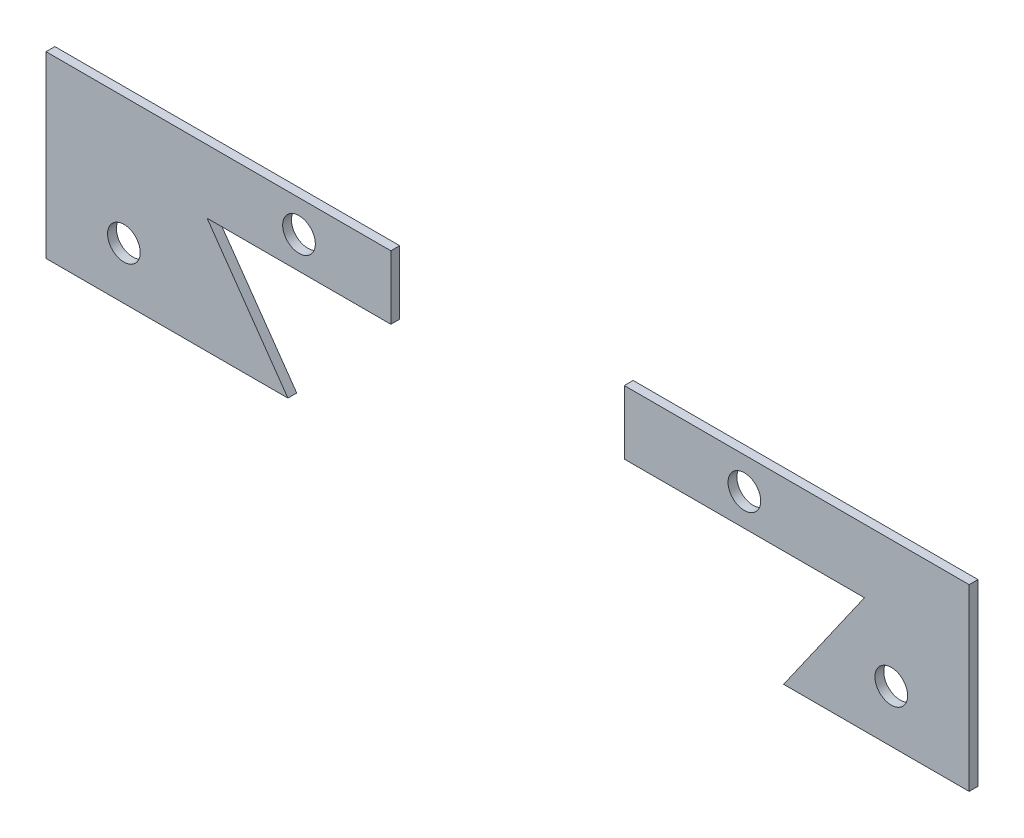
ISO-10303-21;
HEADER;
FILE_DESCRIPTION(('STEP AP214'),'2;1');
FILE_NAME('part.step','',(''),(''),'','','');
FILE_SCHEMA(('AUTOMOTIVE_DESIGN { 1 0 10303 214 1 1 1 1 }'));
ENDSEC;
DATA;
#1=APPLICATION_CONTEXT('core data for automotive mechanical design processes');
#2=APPLICATION_PROTOCOL_DEFINITION('international standard','automotive_design',2000,#1);
#3=PRODUCT_CONTEXT('',#1,'mechanical');
#4=PRODUCT('Part','Part','',(#3));
#5=PRODUCT_RELATED_PRODUCT_CATEGORY('part','',(#4));
#6=PRODUCT_DEFINITION_FORMATION('','',#4);
#7=PRODUCT_DEFINITION_CONTEXT('part definition',#1,'design');
#8=PRODUCT_DEFINITION('design','',#6,#7);
#9=PRODUCT_DEFINITION_SHAPE('','',#8);
#10=(LENGTH_UNIT() NAMED_UNIT(*) SI_UNIT(.MILLI.,.METRE.));
#11=(NAMED_UNIT(*) PLANE_ANGLE_UNIT() SI_UNIT($,.RADIAN.));
#12=(NAMED_UNIT(*) SI_UNIT($,.STERADIAN.) SOLID_ANGLE_UNIT());
#13=UNCERTAINTY_MEASURE_WITH_UNIT(LENGTH_MEASURE(1.E-05),#10,'distance_accuracy_value','');
#14=(GEOMETRIC_REPRESENTATION_CONTEXT(3) GLOBAL_UNCERTAINTY_ASSIGNED_CONTEXT((#13)) GLOBAL_UNIT_ASSIGNED_CONTEXT((#10,
#11,#12)) REPRESENTATION_CONTEXT('',''));
#15=CARTESIAN_POINT('',(0.,0.,0.));
#16=DIRECTION('',(0.,0.,1.));
#17=DIRECTION('',(1.,0.,0.));
#18=AXIS2_PLACEMENT_3D('',#15,#16,#17);
#19=CARTESIAN_POINT('',(79.556336319348,16.6369999999995,1.21412));
#20=DIRECTION('',(1.,0.,0.));
#21=DIRECTION('',(0.,1.,0.));
#22=AXIS2_PLACEMENT_3D('',#19,#20,#21);
#23=PLANE('',#22);
#24=DIRECTION('',(0.,-1.,0.));
#25=VECTOR('',#24,1.);
#26=CARTESIAN_POINT('',(79.556336319348,16.6369999999995,0.));
#27=LINE('',#26,#25);
#28=CARTESIAN_POINT('',(79.5563363193477,25.4000000000002,0.));
#29=VERTEX_POINT('',#28);
#30=CARTESIAN_POINT('',(79.556336319348,16.6369999999995,0.));
#31=VERTEX_POINT('',#30);
#32=EDGE_CURVE('E128',#29,#31,#27,.T.);
#33=ORIENTED_EDGE('',*,*,#32,.T.);
#34=DIRECTION('',(0.,0.,-1.));
#35=VECTOR('',#34,1.);
#36=CARTESIAN_POINT('',(79.556336319348,16.6369999999995,1.21412));
#37=LINE('',#36,#35);
#38=CARTESIAN_POINT('',(79.556336319348,16.6369999999995,1.21412));
#39=VERTEX_POINT('',#38);
#40=EDGE_CURVE('E12',#39,#31,#37,.T.);
#41=ORIENTED_EDGE('',*,*,#40,.F.);
#42=DIRECTION('',(0.,-1.,0.));
#43=VECTOR('',#42,1.);
#44=CARTESIAN_POINT('',(79.556336319348,16.6369999999995,1.21412));
#45=LINE('',#44,#43);
#46=CARTESIAN_POINT('',(79.5563363193477,25.4000000000002,1.21412));
#47=VERTEX_POINT('',#46);
#48=EDGE_CURVE('E139',#47,#39,#45,.T.);
#49=ORIENTED_EDGE('',*,*,#48,.F.);
#50=DIRECTION('',(0.,0.,-1.));
#51=VECTOR('',#50,1.);
#52=CARTESIAN_POINT('',(79.5563363193477,25.4000000000002,1.21412));
#53=LINE('',#52,#51);
#54=EDGE_CURVE('E124',#47,#29,#53,.T.);
#55=ORIENTED_EDGE('',*,*,#54,.T.);
#56=EDGE_LOOP('',(#33,#41,#49,#55));
#57=FACE_BOUND('',#56,.T.);
#58=ADVANCED_FACE('F44',(#57),#23,.F.);
#59=CARTESIAN_POINT('',(112.588788380752,16.6369999999995,1.21412));
#60=DIRECTION('',(0.,1.,0.));
#61=DIRECTION('',(-1.,0.,0.));
#62=AXIS2_PLACEMENT_3D('',#59,#60,#61);
#63=PLANE('',#62);
#64=DIRECTION('',(1.,0.,0.));
#65=VECTOR('',#64,1.);
#66=CARTESIAN_POINT('',(112.588788380752,16.6369999999995,0.));
#67=LINE('',#66,#65);
#68=CARTESIAN_POINT('',(112.588788380752,16.6369999999995,0.));
#69=VERTEX_POINT('',#68);
#70=EDGE_CURVE('E131',#31,#69,#67,.T.);
#71=ORIENTED_EDGE('',*,*,#70,.T.);
#72=DIRECTION('',(0.,0.,-1.));
#73=VECTOR('',#72,1.);
#74=CARTESIAN_POINT('',(112.588788380752,16.6369999999995,1.21412));
#75=LINE('',#74,#73);
#76=CARTESIAN_POINT('',(112.588788380752,16.6369999999995,1.21412));
#77=VERTEX_POINT('',#76);
#78=EDGE_CURVE('E52',#77,#69,#75,.T.);
#79=ORIENTED_EDGE('',*,*,#78,.F.);
#80=DIRECTION('',(1.,0.,0.));
#81=VECTOR('',#80,1.);
#82=CARTESIAN_POINT('',(112.588788380752,16.6369999999995,1.21412));
#83=LINE('',#82,#81);
#84=EDGE_CURVE('E97',#39,#77,#83,.T.);
#85=ORIENTED_EDGE('',*,*,#84,.F.);
#86=ORIENTED_EDGE('',*,*,#40,.T.);
#87=EDGE_LOOP('',(#71,#79,#85,#86));
#88=FACE_BOUND('',#87,.T.);
#89=ADVANCED_FACE('F164',(#88),#63,.F.);
#90=CARTESIAN_POINT('',(101.472993711673,0.762000000000164,1.21412));
#91=DIRECTION('',(0.819152044288988,-0.573576436351051,0.));
#92=DIRECTION('',(0.573576436351051,0.819152044288988,0.));
#93=AXIS2_PLACEMENT_3D('',#90,#91,#92);
#94=PLANE('',#93);
#95=DIRECTION('',(-0.573576436351051,-0.819152044288988,0.));
#96=VECTOR('',#95,1.);
#97=CARTESIAN_POINT('',(101.472993711673,0.762000000000164,0.));
#98=LINE('',#97,#96);
#99=CARTESIAN_POINT('',(101.472993711673,0.762000000000164,0.));
#100=VERTEX_POINT('',#99);
#101=EDGE_CURVE('E134',#69,#100,#98,.T.);
#102=ORIENTED_EDGE('',*,*,#101,.T.);
#103=DIRECTION('',(0.,0.,-1.));
#104=VECTOR('',#103,1.);
#105=CARTESIAN_POINT('',(101.472993711673,0.762000000000164,1.21412));
#106=LINE('',#105,#104);
#107=CARTESIAN_POINT('',(101.472993711673,0.762000000000164,1.21412));
#108=VERTEX_POINT('',#107);
#109=EDGE_CURVE('E119',#108,#100,#106,.T.);
#110=ORIENTED_EDGE('',*,*,#109,.F.);
#111=DIRECTION('',(-0.573576436351051,-0.819152044288988,0.));
#112=VECTOR('',#111,1.);
#113=CARTESIAN_POINT('',(101.472993711673,0.762000000000164,1.21412));
#114=LINE('',#113,#112);
#115=EDGE_CURVE('E110',#77,#108,#114,.T.);
#116=ORIENTED_EDGE('',*,*,#115,.F.);
#117=ORIENTED_EDGE('',*,*,#78,.T.);
#118=EDGE_LOOP('',(#102,#110,#116,#117));
#119=FACE_BOUND('',#118,.T.);
#120=ADVANCED_FACE('F145',(#119),#94,.F.);
#121=CARTESIAN_POINT('',(127.,0.762000000000165,1.21412));
#122=DIRECTION('',(0.,1.,0.));
#123=DIRECTION('',(-1.,0.,0.));
#124=AXIS2_PLACEMENT_3D('',#121,#122,#123);
#125=PLANE('',#124);
#126=DIRECTION('',(1.,0.,0.));
#127=VECTOR('',#126,1.);
#128=CARTESIAN_POINT('',(127.,0.762000000000165,0.));
#129=LINE('',#128,#127);
#130=CARTESIAN_POINT('',(127.,0.762000000000165,0.));
#131=VERTEX_POINT('',#130);
#132=EDGE_CURVE('E118',#100,#131,#129,.T.);
#133=ORIENTED_EDGE('',*,*,#132,.T.);
#134=DIRECTION('',(0.,0.,-1.));
#135=VECTOR('',#134,1.);
#136=CARTESIAN_POINT('',(127.,0.762000000000165,1.21412));
#137=LINE('',#136,#135);
#138=CARTESIAN_POINT('',(127.,0.762000000000165,1.21412));
#139=VERTEX_POINT('',#138);
#140=EDGE_CURVE('E115',#139,#131,#137,.T.);
#141=ORIENTED_EDGE('',*,*,#140,.F.);
#142=DIRECTION('',(1.,0.,0.));
#143=VECTOR('',#142,1.);
#144=CARTESIAN_POINT('',(127.,0.762000000000165,1.21412));
#145=LINE('',#144,#143);
#146=EDGE_CURVE('E104',#108,#139,#145,.T.);
#147=ORIENTED_EDGE('',*,*,#146,.F.);
#148=ORIENTED_EDGE('',*,*,#109,.T.);
#149=EDGE_LOOP('',(#133,#141,#147,#148));
#150=FACE_BOUND('',#149,.T.);
#151=ADVANCED_FACE('F116',(#150),#125,.F.);
#152=CARTESIAN_POINT('',(127.,25.4000000000002,1.21412));
#153=DIRECTION('',(-1.,0.,0.));
#154=DIRECTION('',(0.,0.,1.));
#155=AXIS2_PLACEMENT_3D('',#152,#153,#154);
#156=PLANE('',#155);
#157=DIRECTION('',(0.,1.,0.));
#158=VECTOR('',#157,1.);
#159=CARTESIAN_POINT('',(127.,25.4000000000002,0.));
#160=LINE('',#159,#158);
#161=CARTESIAN_POINT('',(127.,25.4000000000002,0.));
#162=VERTEX_POINT('',#161);
#163=EDGE_CURVE('E83',#131,#162,#160,.T.);
#164=ORIENTED_EDGE('',*,*,#163,.T.);
#165=DIRECTION('',(0.,0.,-1.));
#166=VECTOR('',#165,1.);
#167=CARTESIAN_POINT('',(127.,25.4000000000002,1.21412));
#168=LINE('',#167,#166);
#169=CARTESIAN_POINT('',(127.,25.4000000000002,1.21412));
#170=VERTEX_POINT('',#169);
#171=EDGE_CURVE('E120',#170,#162,#168,.T.);
#172=ORIENTED_EDGE('',*,*,#171,.F.);
#173=DIRECTION('',(0.,1.,0.));
#174=VECTOR('',#173,1.);
#175=CARTESIAN_POINT('',(127.,25.4000000000002,1.21412));
#176=LINE('',#175,#174);
#177=EDGE_CURVE('E108',#139,#170,#176,.T.);
#178=ORIENTED_EDGE('',*,*,#177,.F.);
#179=ORIENTED_EDGE('',*,*,#140,.T.);
#180=EDGE_LOOP('',(#164,#172,#178,#179));
#181=FACE_BOUND('',#180,.T.);
#182=ADVANCED_FACE('F122',(#181),#156,.F.);
#183=CARTESIAN_POINT('',(79.5563363193477,25.4000000000002,1.21412));
#184=DIRECTION('',(0.,-1.,0.));
#185=DIRECTION('',(0.,0.,-1.));
#186=AXIS2_PLACEMENT_3D('',#183,#184,#185);
#187=PLANE('',#186);
#188=DIRECTION('',(-1.,0.,0.));
#189=VECTOR('',#188,1.);
#190=CARTESIAN_POINT('',(79.5563363193477,25.4000000000002,0.));
#191=LINE('',#190,#189);
#192=EDGE_CURVE('E89',#162,#29,#191,.T.);
#193=ORIENTED_EDGE('',*,*,#192,.T.);
#194=ORIENTED_EDGE('',*,*,#54,.F.);
#195=DIRECTION('',(-1.,0.,0.));
#196=VECTOR('',#195,1.);
#197=CARTESIAN_POINT('',(79.5563363193477,25.4000000000002,1.21412));
#198=LINE('',#197,#196);
#199=EDGE_CURVE('E60',#170,#47,#198,.T.);
#200=ORIENTED_EDGE('',*,*,#199,.F.);
#201=ORIENTED_EDGE('',*,*,#171,.T.);
#202=EDGE_LOOP('',(#193,#194,#200,#201));
#203=FACE_BOUND('',#202,.T.);
#204=ADVANCED_FACE('F152',(#203),#187,.F.);
#205=CARTESIAN_POINT('',(0.,0.,1.21412));
#206=DIRECTION('',(0.,0.,-1.));
#207=DIRECTION('',(-1.,0.,0.));
#208=AXIS2_PLACEMENT_3D('',#205,#206,#207);
#209=PLANE('',#208);
#210=CARTESIAN_POINT('',(96.0725623500502,21.0184999999994,1.21411999999999));
#211=DIRECTION('',(0.,0.,1.));
#212=DIRECTION('',(1.,0.,0.));
#213=AXIS2_PLACEMENT_3D('',#210,#211,#212);
#214=CIRCLE('',#213,2.24789999999998);
#215=CARTESIAN_POINT('',(98.3204623500502,21.0184999999994,1.21411999999999));
#216=VERTEX_POINT('',#215);
#217=EDGE_CURVE('E230',#216,#216,#214,.T.);
#218=ORIENTED_EDGE('',*,*,#217,.F.);
#219=EDGE_LOOP('',(#218));
#220=FACE_BOUND('',#219,.T.);
#221=CARTESIAN_POINT('',(116.283551332731,7.93749999999953,1.21411999999999));
#222=DIRECTION('',(0.,0.,1.));
#223=DIRECTION('',(1.,0.,0.));
#224=AXIS2_PLACEMENT_3D('',#221,#222,#223);
#225=CIRCLE('',#224,2.24789999999998);
#226=CARTESIAN_POINT('',(118.531451332731,7.93749999999953,1.21411999999999));
#227=VERTEX_POINT('',#226);
#228=EDGE_CURVE('E232',#227,#227,#225,.T.);
#229=ORIENTED_EDGE('',*,*,#228,.F.);
#230=EDGE_LOOP('',(#229));
#231=FACE_BOUND('',#230,.T.);
#232=ORIENTED_EDGE('',*,*,#48,.T.);
#233=ORIENTED_EDGE('',*,*,#84,.T.);
#234=ORIENTED_EDGE('',*,*,#115,.T.);
#235=ORIENTED_EDGE('',*,*,#146,.T.);
#236=ORIENTED_EDGE('',*,*,#177,.T.);
#237=ORIENTED_EDGE('',*,*,#199,.T.);
#238=EDGE_LOOP('',(#232,#233,#234,#235,#236,#237));
#239=FACE_BOUND('',#238,.T.);
#240=ADVANCED_FACE('F106',(#220,#231,#239),#209,.F.);
#241=CARTESIAN_POINT('',(0.,0.,0.));
#242=DIRECTION('',(0.,0.,-1.));
#243=DIRECTION('',(-1.,0.,0.));
#244=AXIS2_PLACEMENT_3D('',#241,#242,#243);
#245=PLANE('',#244);
#246=CARTESIAN_POINT('',(96.0725623500502,21.0184999999994,0.));
#247=DIRECTION('',(0.,0.,1.));
#248=DIRECTION('',(1.,0.,0.));
#249=AXIS2_PLACEMENT_3D('',#246,#247,#248);
#250=CIRCLE('',#249,2.2479);
#251=CARTESIAN_POINT('',(98.3204623500502,21.0184999999994,0.));
#252=VERTEX_POINT('',#251);
#253=EDGE_CURVE('E227',#252,#252,#250,.T.);
#254=ORIENTED_EDGE('',*,*,#253,.T.);
#255=EDGE_LOOP('',(#254));
#256=FACE_BOUND('',#255,.T.);
#257=CARTESIAN_POINT('',(116.283551332731,7.93749999999953,0.));
#258=DIRECTION('',(0.,0.,1.));
#259=DIRECTION('',(1.,0.,0.));
#260=AXIS2_PLACEMENT_3D('',#257,#258,#259);
#261=CIRCLE('',#260,2.2479);
#262=CARTESIAN_POINT('',(118.531451332731,7.93749999999953,0.));
#263=VERTEX_POINT('',#262);
#264=EDGE_CURVE('E132',#263,#263,#261,.T.);
#265=ORIENTED_EDGE('',*,*,#264,.T.);
#266=EDGE_LOOP('',(#265));
#267=FACE_BOUND('',#266,.T.);
#268=ORIENTED_EDGE('',*,*,#32,.F.);
#269=ORIENTED_EDGE('',*,*,#192,.F.);
#270=ORIENTED_EDGE('',*,*,#163,.F.);
#271=ORIENTED_EDGE('',*,*,#132,.F.);
#272=ORIENTED_EDGE('',*,*,#101,.F.);
#273=ORIENTED_EDGE('',*,*,#70,.F.);
#274=EDGE_LOOP('',(#268,#269,#270,#271,#272,#273));
#275=FACE_BOUND('',#274,.T.);
#276=ADVANCED_FACE('F148',(#256,#267,#275),#245,.T.);
#277=CARTESIAN_POINT('',(116.283551332731,7.93749999999953,1.21411999999999));
#278=DIRECTION('',(0.,0.,1.));
#279=DIRECTION('',(1.,0.,0.));
#280=AXIS2_PLACEMENT_3D('',#277,#278,#279);
#281=CYLINDRICAL_SURFACE('',#280,2.24789999999999);
#282=ORIENTED_EDGE('',*,*,#264,.F.);
#283=EDGE_LOOP('',(#282));
#284=FACE_BOUND('',#283,.T.);
#285=ORIENTED_EDGE('',*,*,#228,.T.);
#286=EDGE_LOOP('',(#285));
#287=FACE_BOUND('',#286,.T.);
#288=ADVANCED_FACE('F201',(#284,#287),#281,.F.);
#289=CARTESIAN_POINT('',(96.0725623500502,21.0184999999994,1.21411999999999));
#290=DIRECTION('',(0.,0.,1.));
#291=DIRECTION('',(1.,0.,0.));
#292=AXIS2_PLACEMENT_3D('',#289,#290,#291);
#293=CYLINDRICAL_SURFACE('',#292,2.24789999999999);
#294=ORIENTED_EDGE('',*,*,#253,.F.);
#295=EDGE_LOOP('',(#294));
#296=FACE_BOUND('',#295,.T.);
#297=ORIENTED_EDGE('',*,*,#217,.T.);
#298=EDGE_LOOP('',(#297));
#299=FACE_BOUND('',#298,.T.);
#300=ADVANCED_FACE('F210',(#296,#299),#293,.F.);
#301=CLOSED_SHELL('',(#58,#89,#120,#151,#182,#204,#240,#276,#288,#300));
#302=MANIFOLD_SOLID_BREP('B2',#301);
#303=CARTESIAN_POINT('',(0.,0.762000000000162,1.21412));
#304=DIRECTION('',(1.,0.,0.));
#305=DIRECTION('',(0.,0.,-1.));
#306=AXIS2_PLACEMENT_3D('',#303,#304,#305);
#307=PLANE('',#306);
#308=DIRECTION('',(0.,-1.,0.));
#309=VECTOR('',#308,1.);
#310=CARTESIAN_POINT('',(0.,0.762000000000162,0.));
#311=LINE('',#310,#309);
#312=CARTESIAN_POINT('',(0.,25.4000000000002,0.));
#313=VERTEX_POINT('',#312);
#314=CARTESIAN_POINT('',(0.,0.762000000000162,0.));
#315=VERTEX_POINT('',#314);
#316=EDGE_CURVE('E345',#313,#315,#311,.T.);
#317=ORIENTED_EDGE('',*,*,#316,.T.);
#318=DIRECTION('',(0.,0.,-1.));
#319=VECTOR('',#318,1.);
#320=CARTESIAN_POINT('',(0.,0.762000000000162,1.21412));
#321=LINE('',#320,#319);
#322=CARTESIAN_POINT('',(0.,0.762000000000162,1.21412));
#323=VERTEX_POINT('',#322);
#324=EDGE_CURVE('E42',#323,#315,#321,.T.);
#325=ORIENTED_EDGE('',*,*,#324,.F.);
#326=DIRECTION('',(0.,-1.,0.));
#327=VECTOR('',#326,1.);
#328=CARTESIAN_POINT('',(0.,0.762000000000162,1.21412));
#329=LINE('',#328,#327);
#330=CARTESIAN_POINT('',(0.,25.4000000000002,1.21412));
#331=VERTEX_POINT('',#330);
#332=EDGE_CURVE('E356',#331,#323,#329,.T.);
#333=ORIENTED_EDGE('',*,*,#332,.F.);
#334=DIRECTION('',(0.,0.,-1.));
#335=VECTOR('',#334,1.);
#336=CARTESIAN_POINT('',(0.,25.4000000000002,1.21412));
#337=LINE('',#336,#335);
#338=EDGE_CURVE('E341',#331,#313,#337,.T.);
#339=ORIENTED_EDGE('',*,*,#338,.T.);
#340=EDGE_LOOP('',(#317,#325,#333,#339));
#341=FACE_BOUND('',#340,.T.);
#342=ADVANCED_FACE('F261',(#341),#307,.F.);
#343=CARTESIAN_POINT('',(33.2789249269625,0.762000000000167,1.21412));
#344=DIRECTION('',(0.,1.,0.));
#345=DIRECTION('',(-1.,0.,0.));
#346=AXIS2_PLACEMENT_3D('',#343,#344,#345);
#347=PLANE('',#346);
#348=DIRECTION('',(1.,0.,0.));
#349=VECTOR('',#348,1.);
#350=CARTESIAN_POINT('',(33.2789249269625,0.762000000000167,0.));
#351=LINE('',#350,#349);
#352=CARTESIAN_POINT('',(33.2789249269625,0.762000000000167,0.));
#353=VERTEX_POINT('',#352);
#354=EDGE_CURVE('E348',#315,#353,#351,.T.);
#355=ORIENTED_EDGE('',*,*,#354,.T.);
#356=DIRECTION('',(0.,0.,-1.));
#357=VECTOR('',#356,1.);
#358=CARTESIAN_POINT('',(33.2789249269625,0.762000000000167,1.21412));
#359=LINE('',#358,#357);
#360=CARTESIAN_POINT('',(33.2789249269625,0.762000000000167,1.21412));
#361=VERTEX_POINT('',#360);
#362=EDGE_CURVE('E269',#361,#353,#359,.T.);
#363=ORIENTED_EDGE('',*,*,#362,.F.);
#364=DIRECTION('',(1.,0.,0.));
#365=VECTOR('',#364,1.);
#366=CARTESIAN_POINT('',(33.2789249269625,0.762000000000167,1.21412));
#367=LINE('',#366,#365);
#368=EDGE_CURVE('E314',#323,#361,#367,.T.);
#369=ORIENTED_EDGE('',*,*,#368,.F.);
#370=ORIENTED_EDGE('',*,*,#324,.T.);
#371=EDGE_LOOP('',(#355,#363,#369,#370));
#372=FACE_BOUND('',#371,.T.);
#373=ADVANCED_FACE('F381',(#372),#347,.F.);
#374=CARTESIAN_POINT('',(22.1631302578837,16.6369999999995,1.21412));
#375=DIRECTION('',(-0.819152044288989,-0.57357643635105,0.));
#376=DIRECTION('',(0.57357643635105,-0.819152044288989,0.));
#377=AXIS2_PLACEMENT_3D('',#374,#375,#376);
#378=PLANE('',#377);
#379=DIRECTION('',(-0.57357643635105,0.819152044288989,0.));
#380=VECTOR('',#379,1.);
#381=CARTESIAN_POINT('',(22.1631302578837,16.6369999999995,0.));
#382=LINE('',#381,#380);
#383=CARTESIAN_POINT('',(22.1631302578837,16.6369999999995,0.));
#384=VERTEX_POINT('',#383);
#385=EDGE_CURVE('E351',#353,#384,#382,.T.);
#386=ORIENTED_EDGE('',*,*,#385,.T.);
#387=DIRECTION('',(0.,0.,-1.));
#388=VECTOR('',#387,1.);
#389=CARTESIAN_POINT('',(22.1631302578837,16.6369999999995,1.21412));
#390=LINE('',#389,#388);
#391=CARTESIAN_POINT('',(22.1631302578837,16.6369999999995,1.21412));
#392=VERTEX_POINT('',#391);
#393=EDGE_CURVE('E336',#392,#384,#390,.T.);
#394=ORIENTED_EDGE('',*,*,#393,.F.);
#395=DIRECTION('',(-0.57357643635105,0.819152044288989,0.));
#396=VECTOR('',#395,1.);
#397=CARTESIAN_POINT('',(22.1631302578837,16.6369999999995,1.21412));
#398=LINE('',#397,#396);
#399=EDGE_CURVE('E327',#361,#392,#398,.T.);
#400=ORIENTED_EDGE('',*,*,#399,.F.);
#401=ORIENTED_EDGE('',*,*,#362,.T.);
#402=EDGE_LOOP('',(#386,#394,#400,#401));
#403=FACE_BOUND('',#402,.T.);
#404=ADVANCED_FACE('F362',(#403),#378,.F.);
#405=CARTESIAN_POINT('',(47.4436636806529,16.6369999999995,1.21412));
#406=DIRECTION('',(0.,1.,0.));
#407=DIRECTION('',(-1.,0.,0.));
#408=AXIS2_PLACEMENT_3D('',#405,#406,#407);
#409=PLANE('',#408);
#410=DIRECTION('',(1.,0.,0.));
#411=VECTOR('',#410,1.);
#412=CARTESIAN_POINT('',(47.4436636806529,16.6369999999995,0.));
#413=LINE('',#412,#411);
#414=CARTESIAN_POINT('',(47.4436636806529,16.6369999999995,0.));
#415=VERTEX_POINT('',#414);
#416=EDGE_CURVE('E335',#384,#415,#413,.T.);
#417=ORIENTED_EDGE('',*,*,#416,.T.);
#418=DIRECTION('',(0.,0.,-1.));
#419=VECTOR('',#418,1.);
#420=CARTESIAN_POINT('',(47.4436636806529,16.6369999999995,1.21412));
#421=LINE('',#420,#419);
#422=CARTESIAN_POINT('',(47.4436636806529,16.6369999999995,1.21412));
#423=VERTEX_POINT('',#422);
#424=EDGE_CURVE('E332',#423,#415,#421,.T.);
#425=ORIENTED_EDGE('',*,*,#424,.F.);
#426=DIRECTION('',(1.,0.,0.));
#427=VECTOR('',#426,1.);
#428=CARTESIAN_POINT('',(47.4436636806529,16.6369999999995,1.21412));
#429=LINE('',#428,#427);
#430=EDGE_CURVE('E321',#392,#423,#429,.T.);
#431=ORIENTED_EDGE('',*,*,#430,.F.);
#432=ORIENTED_EDGE('',*,*,#393,.T.);
#433=EDGE_LOOP('',(#417,#425,#431,#432));
#434=FACE_BOUND('',#433,.T.);
#435=ADVANCED_FACE('F333',(#434),#409,.F.);
#436=CARTESIAN_POINT('',(47.4436636806521,25.4000000000002,1.21412));
#437=DIRECTION('',(-1.,0.,0.));
#438=DIRECTION('',(0.,-1.,0.));
#439=AXIS2_PLACEMENT_3D('',#436,#437,#438);
#440=PLANE('',#439);
#441=DIRECTION('',(0.,1.,0.));
#442=VECTOR('',#441,1.);
#443=CARTESIAN_POINT('',(47.4436636806521,25.4000000000002,0.));
#444=LINE('',#443,#442);
#445=CARTESIAN_POINT('',(47.4436636806521,25.4000000000002,0.));
#446=VERTEX_POINT('',#445);
#447=EDGE_CURVE('E300',#415,#446,#444,.T.);
#448=ORIENTED_EDGE('',*,*,#447,.T.);
#449=DIRECTION('',(0.,0.,-1.));
#450=VECTOR('',#449,1.);
#451=CARTESIAN_POINT('',(47.4436636806521,25.4000000000002,1.21412));
#452=LINE('',#451,#450);
#453=CARTESIAN_POINT('',(47.4436636806521,25.4000000000002,1.21412));
#454=VERTEX_POINT('',#453);
#455=EDGE_CURVE('E337',#454,#446,#452,.T.);
#456=ORIENTED_EDGE('',*,*,#455,.F.);
#457=DIRECTION('',(0.,1.,0.));
#458=VECTOR('',#457,1.);
#459=CARTESIAN_POINT('',(47.4436636806521,25.4000000000002,1.21412));
#460=LINE('',#459,#458);
#461=EDGE_CURVE('E325',#423,#454,#460,.T.);
#462=ORIENTED_EDGE('',*,*,#461,.F.);
#463=ORIENTED_EDGE('',*,*,#424,.T.);
#464=EDGE_LOOP('',(#448,#456,#462,#463));
#465=FACE_BOUND('',#464,.T.);
#466=ADVANCED_FACE('F339',(#465),#440,.F.);
#467=CARTESIAN_POINT('',(0.,25.4000000000002,1.21412));
#468=DIRECTION('',(0.,-1.,0.));
#469=DIRECTION('',(0.,0.,-1.));
#470=AXIS2_PLACEMENT_3D('',#467,#468,#469);
#471=PLANE('',#470);
#472=DIRECTION('',(-1.,0.,0.));
#473=VECTOR('',#472,1.);
#474=CARTESIAN_POINT('',(0.,25.4000000000002,0.));
#475=LINE('',#474,#473);
#476=EDGE_CURVE('E306',#446,#313,#475,.T.);
#477=ORIENTED_EDGE('',*,*,#476,.T.);
#478=ORIENTED_EDGE('',*,*,#338,.F.);
#479=DIRECTION('',(-1.,0.,0.));
#480=VECTOR('',#479,1.);
#481=CARTESIAN_POINT('',(0.,25.4000000000002,1.21412));
#482=LINE('',#481,#480);
#483=EDGE_CURVE('E277',#454,#331,#482,.T.);
#484=ORIENTED_EDGE('',*,*,#483,.F.);
#485=ORIENTED_EDGE('',*,*,#455,.T.);
#486=EDGE_LOOP('',(#477,#478,#484,#485));
#487=FACE_BOUND('',#486,.T.);
#488=ADVANCED_FACE('F369',(#487),#471,.F.);
#489=CARTESIAN_POINT('',(0.,0.,1.21412));
#490=DIRECTION('',(0.,0.,-1.));
#491=DIRECTION('',(-1.,0.,0.));
#492=AXIS2_PLACEMENT_3D('',#489,#490,#491);
#493=PLANE('',#492);
#494=CARTESIAN_POINT('',(10.71644866727,7.93749999999951,1.21411999999999));
#495=DIRECTION('',(0.,0.,1.));
#496=DIRECTION('',(1.,0.,0.));
#497=AXIS2_PLACEMENT_3D('',#494,#495,#496);
#498=CIRCLE('',#497,2.24789999999999);
#499=CARTESIAN_POINT('',(12.96434866727,7.93749999999951,1.21411999999999));
#500=VERTEX_POINT('',#499);
#501=EDGE_CURVE('E447',#500,#500,#498,.T.);
#502=ORIENTED_EDGE('',*,*,#501,.F.);
#503=EDGE_LOOP('',(#502));
#504=FACE_BOUND('',#503,.T.);
#505=CARTESIAN_POINT('',(34.8033969692684,21.0184999999994,1.21411999999999));
#506=DIRECTION('',(0.,0.,1.));
#507=DIRECTION('',(1.,0.,0.));
#508=AXIS2_PLACEMENT_3D('',#505,#506,#507);
#509=CIRCLE('',#508,2.24789999999999);
#510=CARTESIAN_POINT('',(37.0512969692684,21.0184999999994,1.21411999999999));
#511=VERTEX_POINT('',#510);
#512=EDGE_CURVE('E449',#511,#511,#509,.T.);
#513=ORIENTED_EDGE('',*,*,#512,.F.);
#514=EDGE_LOOP('',(#513));
#515=FACE_BOUND('',#514,.T.);
#516=ORIENTED_EDGE('',*,*,#332,.T.);
#517=ORIENTED_EDGE('',*,*,#368,.T.);
#518=ORIENTED_EDGE('',*,*,#399,.T.);
#519=ORIENTED_EDGE('',*,*,#430,.T.);
#520=ORIENTED_EDGE('',*,*,#461,.T.);
#521=ORIENTED_EDGE('',*,*,#483,.T.);
#522=EDGE_LOOP('',(#516,#517,#518,#519,#520,#521));
#523=FACE_BOUND('',#522,.T.);
#524=ADVANCED_FACE('F323',(#504,#515,#523),#493,.F.);
#525=CARTESIAN_POINT('',(0.,0.,0.));
#526=DIRECTION('',(0.,0.,-1.));
#527=DIRECTION('',(-1.,0.,0.));
#528=AXIS2_PLACEMENT_3D('',#525,#526,#527);
#529=PLANE('',#528);
#530=CARTESIAN_POINT('',(10.71644866727,7.93749999999951,0.));
#531=DIRECTION('',(0.,0.,1.));
#532=DIRECTION('',(1.,0.,0.));
#533=AXIS2_PLACEMENT_3D('',#530,#531,#532);
#534=CIRCLE('',#533,2.2479);
#535=CARTESIAN_POINT('',(12.96434866727,7.93749999999951,0.));
#536=VERTEX_POINT('',#535);
#537=EDGE_CURVE('E444',#536,#536,#534,.T.);
#538=ORIENTED_EDGE('',*,*,#537,.T.);
#539=EDGE_LOOP('',(#538));
#540=FACE_BOUND('',#539,.T.);
#541=CARTESIAN_POINT('',(34.8033969692684,21.0184999999994,0.));
#542=DIRECTION('',(0.,0.,1.));
#543=DIRECTION('',(1.,0.,0.));
#544=AXIS2_PLACEMENT_3D('',#541,#542,#543);
#545=CIRCLE('',#544,2.2479);
#546=CARTESIAN_POINT('',(37.0512969692684,21.0184999999994,0.));
#547=VERTEX_POINT('',#546);
#548=EDGE_CURVE('E349',#547,#547,#545,.T.);
#549=ORIENTED_EDGE('',*,*,#548,.T.);
#550=EDGE_LOOP('',(#549));
#551=FACE_BOUND('',#550,.T.);
#552=ORIENTED_EDGE('',*,*,#316,.F.);
#553=ORIENTED_EDGE('',*,*,#476,.F.);
#554=ORIENTED_EDGE('',*,*,#447,.F.);
#555=ORIENTED_EDGE('',*,*,#416,.F.);
#556=ORIENTED_EDGE('',*,*,#385,.F.);
#557=ORIENTED_EDGE('',*,*,#354,.F.);
#558=EDGE_LOOP('',(#552,#553,#554,#555,#556,#557));
#559=FACE_BOUND('',#558,.T.);
#560=ADVANCED_FACE('F365',(#540,#551,#559),#529,.T.);
#561=CARTESIAN_POINT('',(34.8033969692684,21.0184999999994,1.21411999999999));
#562=DIRECTION('',(0.,0.,1.));
#563=DIRECTION('',(1.,0.,0.));
#564=AXIS2_PLACEMENT_3D('',#561,#562,#563);
#565=CYLINDRICAL_SURFACE('',#564,2.24789999999999);
#566=ORIENTED_EDGE('',*,*,#548,.F.);
#567=EDGE_LOOP('',(#566));
#568=FACE_BOUND('',#567,.T.);
#569=ORIENTED_EDGE('',*,*,#512,.T.);
#570=EDGE_LOOP('',(#569));
#571=FACE_BOUND('',#570,.T.);
#572=ADVANCED_FACE('F418',(#568,#571),#565,.F.);
#573=CARTESIAN_POINT('',(10.71644866727,7.93749999999951,1.21411999999999));
#574=DIRECTION('',(0.,0.,1.));
#575=DIRECTION('',(1.,0.,0.));
#576=AXIS2_PLACEMENT_3D('',#573,#574,#575);
#577=CYLINDRICAL_SURFACE('',#576,2.24789999999999);
#578=ORIENTED_EDGE('',*,*,#537,.F.);
#579=EDGE_LOOP('',(#578));
#580=FACE_BOUND('',#579,.T.);
#581=ORIENTED_EDGE('',*,*,#501,.T.);
#582=EDGE_LOOP('',(#581));
#583=FACE_BOUND('',#582,.T.);
#584=ADVANCED_FACE('F427',(#580,#583),#577,.F.);
#585=CLOSED_SHELL('',(#342,#373,#404,#435,#466,#488,#524,#560,#572,#584));
#586=MANIFOLD_SOLID_BREP('B6',#585);
#587=ADVANCED_BREP_SHAPE_REPRESENTATION('',(#18,#302,#586),#14);
#588=SHAPE_DEFINITION_REPRESENTATION(#9,#587);
ENDSEC;
END-ISO-10303-21;
